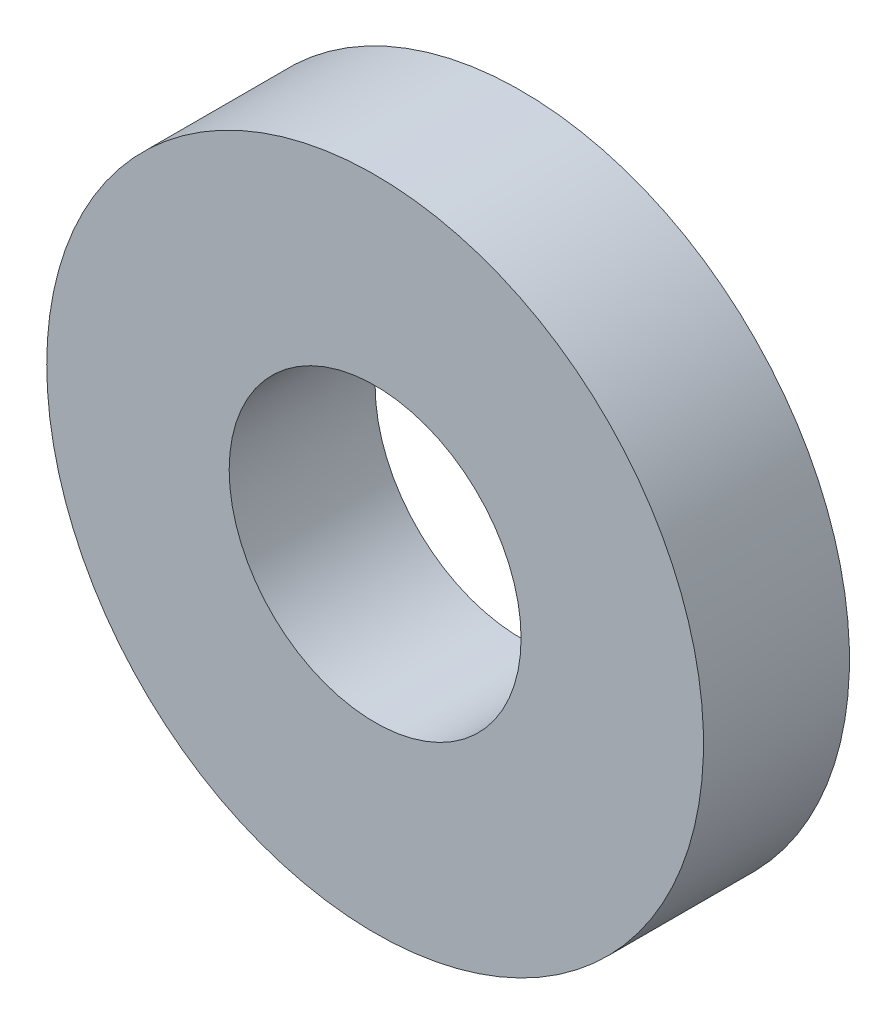
ISO-10303-21;
HEADER;
FILE_DESCRIPTION(('STEP AP214'),'2;1');
FILE_NAME('part.step','',(''),(''),'','','');
FILE_SCHEMA(('AUTOMOTIVE_DESIGN { 1 0 10303 214 1 1 1 1 }'));
ENDSEC;
DATA;
#1=APPLICATION_CONTEXT('core data for automotive mechanical design processes');
#2=APPLICATION_PROTOCOL_DEFINITION('international standard','automotive_design',2000,#1);
#3=PRODUCT_CONTEXT('',#1,'mechanical');
#4=PRODUCT('Part','Part','',(#3));
#5=PRODUCT_RELATED_PRODUCT_CATEGORY('part','',(#4));
#6=PRODUCT_DEFINITION_FORMATION('','',#4);
#7=PRODUCT_DEFINITION_CONTEXT('part definition',#1,'design');
#8=PRODUCT_DEFINITION('design','',#6,#7);
#9=PRODUCT_DEFINITION_SHAPE('','',#8);
#10=(LENGTH_UNIT() NAMED_UNIT(*) SI_UNIT(.MILLI.,.METRE.));
#11=(NAMED_UNIT(*) PLANE_ANGLE_UNIT() SI_UNIT($,.RADIAN.));
#12=(NAMED_UNIT(*) SI_UNIT($,.STERADIAN.) SOLID_ANGLE_UNIT());
#13=UNCERTAINTY_MEASURE_WITH_UNIT(LENGTH_MEASURE(1.E-05),#10,'distance_accuracy_value','');
#14=(GEOMETRIC_REPRESENTATION_CONTEXT(3) GLOBAL_UNCERTAINTY_ASSIGNED_CONTEXT((#13)) GLOBAL_UNIT_ASSIGNED_CONTEXT((#10,
#11,#12)) REPRESENTATION_CONTEXT('',''));
#15=CARTESIAN_POINT('',(0.,0.,0.));
#16=DIRECTION('',(0.,0.,1.));
#17=DIRECTION('',(1.,0.,0.));
#18=AXIS2_PLACEMENT_3D('',#15,#16,#17);
#19=CARTESIAN_POINT('',(0.,0.,6.35));
#20=DIRECTION('',(0.,0.,-1.));
#21=DIRECTION('',(-1.,0.,0.));
#22=AXIS2_PLACEMENT_3D('',#19,#20,#21);
#23=CYLINDRICAL_SURFACE('',#22,6.35);
#24=CARTESIAN_POINT('',(0.,0.,0.));
#25=DIRECTION('',(0.,0.,-1.));
#26=DIRECTION('',(-1.,0.,0.));
#27=AXIS2_PLACEMENT_3D('',#24,#25,#26);
#28=CIRCLE('',#27,6.35);
#29=CARTESIAN_POINT('',(-6.35,0.,0.));
#30=VERTEX_POINT('',#29);
#31=EDGE_CURVE('E27',#30,#30,#28,.F.);
#32=ORIENTED_EDGE('',*,*,#31,.F.);
#33=EDGE_LOOP('',(#32));
#34=FACE_BOUND('',#33,.T.);
#35=CARTESIAN_POINT('',(0.,0.,6.35));
#36=DIRECTION('',(0.,0.,-1.));
#37=DIRECTION('',(-1.,0.,0.));
#38=AXIS2_PLACEMENT_3D('',#35,#36,#37);
#39=CIRCLE('',#38,6.35);
#40=CARTESIAN_POINT('',(-6.35,0.,6.35));
#41=VERTEX_POINT('',#40);
#42=EDGE_CURVE('E18',#41,#41,#39,.F.);
#43=ORIENTED_EDGE('',*,*,#42,.T.);
#44=EDGE_LOOP('',(#43));
#45=FACE_BOUND('',#44,.T.);
#46=ADVANCED_FACE('F15',(#34,#45),#23,.F.);
#47=CARTESIAN_POINT('',(0.,0.,6.35));
#48=DIRECTION('',(0.,0.,-1.));
#49=DIRECTION('',(-1.,0.,0.));
#50=AXIS2_PLACEMENT_3D('',#47,#48,#49);
#51=PLANE('',#50);
#52=CARTESIAN_POINT('',(0.,0.,6.35));
#53=DIRECTION('',(0.,0.,-1.));
#54=DIRECTION('',(-1.,0.,0.));
#55=AXIS2_PLACEMENT_3D('',#52,#53,#54);
#56=CIRCLE('',#55,14.2875);
#57=CARTESIAN_POINT('',(-14.2875,0.,6.35));
#58=VERTEX_POINT('',#57);
#59=EDGE_CURVE('E22',#58,#58,#56,.T.);
#60=ORIENTED_EDGE('',*,*,#59,.F.);
#61=EDGE_LOOP('',(#60));
#62=FACE_BOUND('',#61,.T.);
#63=ORIENTED_EDGE('',*,*,#42,.F.);
#64=EDGE_LOOP('',(#63));
#65=FACE_BOUND('',#64,.T.);
#66=ADVANCED_FACE('F36',(#62,#65),#51,.F.);
#67=CARTESIAN_POINT('',(0.,0.,0.));
#68=DIRECTION('',(0.,0.,-1.));
#69=DIRECTION('',(-1.,0.,0.));
#70=AXIS2_PLACEMENT_3D('',#67,#68,#69);
#71=PLANE('',#70);
#72=CARTESIAN_POINT('',(0.,0.,0.));
#73=DIRECTION('',(0.,0.,-1.));
#74=DIRECTION('',(-1.,0.,0.));
#75=AXIS2_PLACEMENT_3D('',#72,#73,#74);
#76=CIRCLE('',#75,14.2875);
#77=CARTESIAN_POINT('',(-14.2875,0.,0.));
#78=VERTEX_POINT('',#77);
#79=EDGE_CURVE('E10',#78,#78,#76,.F.);
#80=ORIENTED_EDGE('',*,*,#79,.F.);
#81=EDGE_LOOP('',(#80));
#82=FACE_BOUND('',#81,.T.);
#83=ORIENTED_EDGE('',*,*,#31,.T.);
#84=EDGE_LOOP('',(#83));
#85=FACE_BOUND('',#84,.T.);
#86=ADVANCED_FACE('F38',(#82,#85),#71,.T.);
#87=CARTESIAN_POINT('',(0.,0.,6.35));
#88=DIRECTION('',(0.,0.,-1.));
#89=DIRECTION('',(-1.,0.,0.));
#90=AXIS2_PLACEMENT_3D('',#87,#88,#89);
#91=CYLINDRICAL_SURFACE('',#90,14.2875);
#92=ORIENTED_EDGE('',*,*,#79,.T.);
#93=EDGE_LOOP('',(#92));
#94=FACE_BOUND('',#93,.T.);
#95=ORIENTED_EDGE('',*,*,#59,.T.);
#96=EDGE_LOOP('',(#95));
#97=FACE_BOUND('',#96,.T.);
#98=ADVANCED_FACE('F45',(#94,#97),#91,.T.);
#99=CLOSED_SHELL('',(#46,#66,#86,#98));
#100=MANIFOLD_SOLID_BREP('B1',#99);
#101=ADVANCED_BREP_SHAPE_REPRESENTATION('',(#18,#100),#14);
#102=SHAPE_DEFINITION_REPRESENTATION(#9,#101);
ENDSEC;
END-ISO-10303-21;
